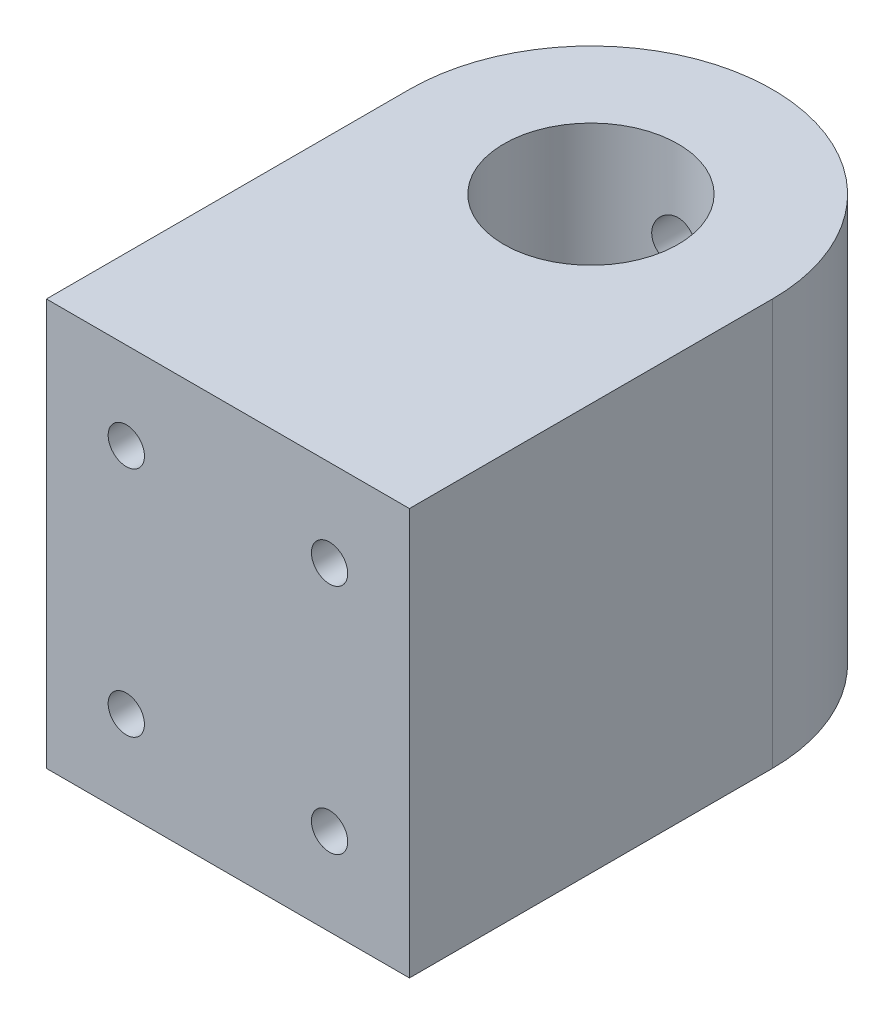
ISO-10303-21;
HEADER;
FILE_DESCRIPTION(('STEP AP214'),'2;1');
FILE_NAME('part.step','',(''),(''),'','','');
FILE_SCHEMA(('AUTOMOTIVE_DESIGN { 1 0 10303 214 1 1 1 1 }'));
ENDSEC;
DATA;
#1=APPLICATION_CONTEXT('core data for automotive mechanical design processes');
#2=APPLICATION_PROTOCOL_DEFINITION('international standard','automotive_design',2000,#1);
#3=PRODUCT_CONTEXT('',#1,'mechanical');
#4=PRODUCT('Part','Part','',(#3));
#5=PRODUCT_RELATED_PRODUCT_CATEGORY('part','',(#4));
#6=PRODUCT_DEFINITION_FORMATION('','',#4);
#7=PRODUCT_DEFINITION_CONTEXT('part definition',#1,'design');
#8=PRODUCT_DEFINITION('design','',#6,#7);
#9=PRODUCT_DEFINITION_SHAPE('','',#8);
#10=(LENGTH_UNIT() NAMED_UNIT(*) SI_UNIT(.MILLI.,.METRE.));
#11=(NAMED_UNIT(*) PLANE_ANGLE_UNIT() SI_UNIT($,.RADIAN.));
#12=(NAMED_UNIT(*) SI_UNIT($,.STERADIAN.) SOLID_ANGLE_UNIT());
#13=UNCERTAINTY_MEASURE_WITH_UNIT(LENGTH_MEASURE(1.E-05),#10,'distance_accuracy_value','');
#14=(GEOMETRIC_REPRESENTATION_CONTEXT(3) GLOBAL_UNCERTAINTY_ASSIGNED_CONTEXT((#13)) GLOBAL_UNIT_ASSIGNED_CONTEXT((#10,
#11,#12)) REPRESENTATION_CONTEXT('',''));
#15=CARTESIAN_POINT('',(0.,0.,0.));
#16=DIRECTION('',(0.,0.,1.));
#17=DIRECTION('',(1.,0.,0.));
#18=AXIS2_PLACEMENT_3D('',#15,#16,#17);
#19=CARTESIAN_POINT('',(0.,14.,0.));
#20=DIRECTION('',(0.,1.,0.));
#21=DIRECTION('',(0.,0.,1.));
#22=AXIS2_PLACEMENT_3D('',#19,#20,#21);
#23=PLANE('',#22);
#24=CARTESIAN_POINT('',(0.,14.,0.));
#25=DIRECTION('',(0.,1.,0.));
#26=DIRECTION('',(0.,0.,1.));
#27=AXIS2_PLACEMENT_3D('',#24,#25,#26);
#28=CIRCLE('',#27,12.5);
#29=CARTESIAN_POINT('',(12.5,14.,0.));
#30=VERTEX_POINT('',#29);
#31=CARTESIAN_POINT('',(-12.5,14.,0.));
#32=VERTEX_POINT('',#31);
#33=EDGE_CURVE('E178',#30,#32,#28,.T.);
#34=ORIENTED_EDGE('',*,*,#33,.T.);
#35=DIRECTION('',(0.,0.,1.));
#36=VECTOR('',#35,1.);
#37=CARTESIAN_POINT('',(-12.5,14.,25.));
#38=LINE('',#37,#36);
#39=CARTESIAN_POINT('',(-12.5,14.,25.));
#40=VERTEX_POINT('',#39);
#41=EDGE_CURVE('E95',#32,#40,#38,.T.);
#42=ORIENTED_EDGE('',*,*,#41,.T.);
#43=DIRECTION('',(1.,0.,0.));
#44=VECTOR('',#43,1.);
#45=CARTESIAN_POINT('',(-12.5,14.,25.));
#46=LINE('',#45,#44);
#47=CARTESIAN_POINT('',(12.5,14.,25.));
#48=VERTEX_POINT('',#47);
#49=EDGE_CURVE('E187',#40,#48,#46,.T.);
#50=ORIENTED_EDGE('',*,*,#49,.T.);
#51=DIRECTION('',(0.,0.,-1.));
#52=VECTOR('',#51,1.);
#53=CARTESIAN_POINT('',(12.5,14.,25.));
#54=LINE('',#53,#52);
#55=EDGE_CURVE('E64',#48,#30,#54,.T.);
#56=ORIENTED_EDGE('',*,*,#55,.T.);
#57=EDGE_LOOP('',(#34,#42,#50,#56));
#58=FACE_BOUND('',#57,.T.);
#59=CARTESIAN_POINT('',(0.,14.,0.));
#60=DIRECTION('',(0.,1.,0.));
#61=DIRECTION('',(0.,0.,1.));
#62=AXIS2_PLACEMENT_3D('',#59,#60,#61);
#63=CIRCLE('',#62,6.);
#64=CARTESIAN_POINT('',(0.,14.,6.));
#65=VERTEX_POINT('',#64);
#66=EDGE_CURVE('E185',#65,#65,#63,.T.);
#67=ORIENTED_EDGE('',*,*,#66,.F.);
#68=EDGE_LOOP('',(#67));
#69=FACE_BOUND('',#68,.T.);
#70=ADVANCED_FACE('F40',(#58,#69),#23,.T.);
#71=CARTESIAN_POINT('',(0.,-14.,0.));
#72=DIRECTION('',(0.,1.,0.));
#73=DIRECTION('',(0.,0.,1.));
#74=AXIS2_PLACEMENT_3D('',#71,#72,#73);
#75=PLANE('',#74);
#76=CARTESIAN_POINT('',(0.,-14.,0.));
#77=DIRECTION('',(0.,1.,0.));
#78=DIRECTION('',(0.,0.,1.));
#79=AXIS2_PLACEMENT_3D('',#76,#77,#78);
#80=CIRCLE('',#79,12.5);
#81=CARTESIAN_POINT('',(12.5,-14.,0.));
#82=VERTEX_POINT('',#81);
#83=CARTESIAN_POINT('',(-12.5,-14.,0.));
#84=VERTEX_POINT('',#83);
#85=EDGE_CURVE('E182',#82,#84,#80,.T.);
#86=ORIENTED_EDGE('',*,*,#85,.F.);
#87=DIRECTION('',(0.,0.,-1.));
#88=VECTOR('',#87,1.);
#89=CARTESIAN_POINT('',(12.5,-14.,25.));
#90=LINE('',#89,#88);
#91=CARTESIAN_POINT('',(12.5,-14.,25.));
#92=VERTEX_POINT('',#91);
#93=EDGE_CURVE('E88',#92,#82,#90,.T.);
#94=ORIENTED_EDGE('',*,*,#93,.F.);
#95=DIRECTION('',(1.,0.,0.));
#96=VECTOR('',#95,1.);
#97=CARTESIAN_POINT('',(-12.5,-14.,25.));
#98=LINE('',#97,#96);
#99=CARTESIAN_POINT('',(-12.5,-14.,25.));
#100=VERTEX_POINT('',#99);
#101=EDGE_CURVE('E82',#100,#92,#98,.T.);
#102=ORIENTED_EDGE('',*,*,#101,.F.);
#103=DIRECTION('',(0.,0.,1.));
#104=VECTOR('',#103,1.);
#105=CARTESIAN_POINT('',(-12.5,-14.,25.));
#106=LINE('',#105,#104);
#107=EDGE_CURVE('E180',#84,#100,#106,.T.);
#108=ORIENTED_EDGE('',*,*,#107,.F.);
#109=EDGE_LOOP('',(#86,#94,#102,#108));
#110=FACE_BOUND('',#109,.T.);
#111=CARTESIAN_POINT('',(0.,-14.,0.));
#112=DIRECTION('',(0.,1.,0.));
#113=DIRECTION('',(0.,0.,1.));
#114=AXIS2_PLACEMENT_3D('',#111,#112,#113);
#115=CIRCLE('',#114,6.);
#116=CARTESIAN_POINT('',(0.,-14.,6.));
#117=VERTEX_POINT('',#116);
#118=EDGE_CURVE('E191',#117,#117,#115,.T.);
#119=ORIENTED_EDGE('',*,*,#118,.T.);
#120=EDGE_LOOP('',(#119));
#121=FACE_BOUND('',#120,.T.);
#122=ADVANCED_FACE('F199',(#110,#121),#75,.F.);
#123=CARTESIAN_POINT('',(0.,14.,0.));
#124=DIRECTION('',(0.,-1.,0.));
#125=DIRECTION('',(0.,0.,-1.));
#126=AXIS2_PLACEMENT_3D('',#123,#124,#125);
#127=CYLINDRICAL_SURFACE('',#126,12.5);
#128=CARTESIAN_POINT('',(0.,9.6,-12.5));
#129=CARTESIAN_POINT('',(-0.0894802285816259,9.59999620967843,-12.4999987273405));
#130=CARTESIAN_POINT('',(-0.179015931675331,9.59246839578162,-12.499029056014));
#131=CARTESIAN_POINT('',(-0.355594628622663,9.56255800254797,-12.4952541222134));
#132=CARTESIAN_POINT('',(-0.44263494147155,9.540160028126,-12.4924469574237));
#133=CARTESIAN_POINT('',(-0.611641054255219,9.48118108672698,-12.4853131928751));
#134=CARTESIAN_POINT('',(-0.693610272484019,9.44460979712003,-12.4809876300497));
#135=CARTESIAN_POINT('',(-0.850232699633243,9.35834380168914,-12.4712978138664));
#136=CARTESIAN_POINT('',(-0.92488713401849,9.30865129926813,-12.4659337349434));
#137=CARTESIAN_POINT('',(-1.0652061611174,9.19724751808118,-12.4547309610872));
#138=CARTESIAN_POINT('',(-1.1308225327694,9.13547572738356,-12.4488899665847));
#139=CARTESIAN_POINT('',(-1.25078744700971,9.00179681121915,-12.437410158438));
#140=CARTESIAN_POINT('',(-1.30513540756856,8.92988916254297,-12.4317713552498));
#141=CARTESIAN_POINT('',(-1.40120131878558,8.77766511768412,-12.4213117857827));
#142=CARTESIAN_POINT('',(-1.44287391980583,8.69731988094322,-12.4164939832712));
#143=CARTESIAN_POINT('',(-1.51211654458473,8.53069940043074,-12.4082523672039));
#144=CARTESIAN_POINT('',(-1.53968712861921,8.44442439240461,-12.4048284982681));
#145=CARTESIAN_POINT('',(-1.57979618302578,8.2688946901791,-12.3997844564613));
#146=CARTESIAN_POINT('',(-1.59241621355555,8.17965891876555,-12.3981545007017));
#147=CARTESIAN_POINT('',(-1.60251833190295,8.00032233106304,-12.3968529255545));
#148=CARTESIAN_POINT('',(-1.6000010570764,7.9102215513547,-12.3971812237147));
#149=CARTESIAN_POINT('',(-1.57996693859598,7.73228183611032,-12.3997501103633));
#150=CARTESIAN_POINT('',(-1.56254004625942,7.64443258388437,-12.4019792307219));
#151=CARTESIAN_POINT('',(-1.51332177543579,7.47291569892478,-12.4080807060494));
#152=CARTESIAN_POINT('',(-1.48153009300948,7.38924815471194,-12.4119530957876));
#153=CARTESIAN_POINT('',(-1.40438835528284,7.22819089610096,-12.420917754726));
#154=CARTESIAN_POINT('',(-1.35899932073846,7.15082005430809,-12.4260135225035));
#155=CARTESIAN_POINT('',(-1.2559791774554,7.00475931740199,-12.436848087927));
#156=CARTESIAN_POINT('',(-1.19834748171951,6.93606983878486,-12.4425869163993));
#157=CARTESIAN_POINT('',(-1.07197998078475,6.80879964922306,-12.4541119267274));
#158=CARTESIAN_POINT('',(-1.00316666356942,6.75029587679708,-12.4598981501205));
#159=CARTESIAN_POINT('',(-0.856655860376901,6.64565723817514,-12.4708270736414));
#160=CARTESIAN_POINT('',(-0.778958352182545,6.5995224029118,-12.47596977216));
#161=CARTESIAN_POINT('',(-0.616824567175368,6.52093075032636,-12.4850356169908));
#162=CARTESIAN_POINT('',(-0.532385869092663,6.48847887411384,-12.4889583226125));
#163=CARTESIAN_POINT('',(-0.35919633701333,6.43823604801821,-12.4951382424324));
#164=CARTESIAN_POINT('',(-0.270445714989223,6.42044437821569,-12.4973955384135));
#165=CARTESIAN_POINT('',(-0.0918167515699816,6.40012700959609,-12.4999796501206));
#166=CARTESIAN_POINT('',(-0.00195064871834218,6.39749534784532,-12.5003198651777));
#167=CARTESIAN_POINT('',(0.17694133611066,6.40729288149859,-12.4990676925075));
#168=CARTESIAN_POINT('',(0.265967236826347,6.41972174021674,-12.4974753479835));
#169=CARTESIAN_POINT('',(0.440338117066494,6.45919946579896,-12.4925453163349));
#170=CARTESIAN_POINT('',(0.525694748548654,6.48619768618058,-12.4892136767036));
#171=CARTESIAN_POINT('',(0.690668995940678,6.55399501584473,-12.4811779750741));
#172=CARTESIAN_POINT('',(0.770286408285864,6.59479461435722,-12.4764738644255));
#173=CARTESIAN_POINT('',(0.921994603640622,6.68929205705903,-12.4661840779527));
#174=CARTESIAN_POINT('',(0.994042464202555,6.74305829818892,-12.4605937831078));
#175=CARTESIAN_POINT('',(1.12812939052348,6.8618662084161,-12.449171101846));
#176=CARTESIAN_POINT('',(1.19016803872729,6.92690834767634,-12.4433387053422));
#177=CARTESIAN_POINT('',(1.30285251542755,7.0668890712877,-12.4320476984862));
#178=CARTESIAN_POINT('',(1.35342801356351,7.1418844975014,-12.4265915313144));
#179=CARTESIAN_POINT('',(1.4412643372584,7.29936771524115,-12.4167112819757));
#180=CARTESIAN_POINT('',(1.47852544058671,7.38185535041719,-12.412287178278));
#181=CARTESIAN_POINT('',(1.53856194060305,7.55175644772714,-12.4049887339945));
#182=CARTESIAN_POINT('',(1.56137669650311,7.63915581334673,-12.402110185814));
#183=CARTESIAN_POINT('',(1.59199947328775,7.81658438483018,-12.3982168029281));
#184=CARTESIAN_POINT('',(1.5998082290268,7.90661346169601,-12.3972018769598));
#185=CARTESIAN_POINT('',(1.60018341763843,8.08604603654271,-12.3971533974092));
#186=CARTESIAN_POINT('',(1.59286034966409,8.17544931965463,-12.3981054798688));
#187=CARTESIAN_POINT('',(1.56341406955244,8.3517430461862,-12.4018528226023));
#188=CARTESIAN_POINT('',(1.5412908582596,8.43863348974923,-12.4046480827711));
#189=CARTESIAN_POINT('',(1.48290735295564,8.60741869827694,-12.4117623181005));
#190=CARTESIAN_POINT('',(1.44665265140134,8.68931542466838,-12.4160806904338));
#191=CARTESIAN_POINT('',(1.36104616807924,8.84588076445767,-12.4257555410229));
#192=CARTESIAN_POINT('',(1.31169419076938,8.92054926991562,-12.4311120347776));
#193=CARTESIAN_POINT('',(1.20088500594448,9.0611031143029,-12.4423064236852));
#194=CARTESIAN_POINT('',(1.13934548813475,9.12692331925843,-12.4481474258925));
#195=CARTESIAN_POINT('',(1.00608024349137,9.24734465846945,-12.4596254256836));
#196=CARTESIAN_POINT('',(0.934352122786102,9.30194314871966,-12.4652623749325));
#197=CARTESIAN_POINT('',(0.782416832255792,9.39855763892584,-12.4757220565273));
#198=CARTESIAN_POINT('',(0.70217702349394,9.44052264875535,-12.4805414558997));
#199=CARTESIAN_POINT('',(0.53577133773657,9.51032195627665,-12.4887894105534));
#200=CARTESIAN_POINT('',(0.44961198188554,9.53817152925444,-12.4922194685257));
#201=CARTESIAN_POINT('',(0.302510950691842,9.57232134620841,-12.4964802335958));
#202=CARTESIAN_POINT('',(0.242494895059007,9.58268582111948,-12.4977936774923));
#203=CARTESIAN_POINT('',(0.121661104986523,9.59652640954901,-12.4995539899657));
#204=CARTESIAN_POINT('',(0.06084337686048,9.60000257728402,-12.5000008653632));
#205=CARTESIAN_POINT('',(0.,9.6,-12.5));
#206=B_SPLINE_CURVE_WITH_KNOTS('',3,(#128,#129,#130,#131,#132,#133,#134,#135,#136,#137,#138,
#139,#140,#141,#142,#143,#144,#145,#146,#147,#148,#149,#150,#151,#152,#153,#154,#155,#156,#157,
#158,#159,#160,#161,#162,#163,#164,#165,#166,#167,#168,#169,#170,#171,#172,#173,#174,#175,#176,
#177,#178,#179,#180,#181,#182,#183,#184,#185,#186,#187,#188,#189,#190,#191,#192,#193,#194,#195,
#196,#197,#198,#199,#200,#201,#202,#203,#204,#205),.UNSPECIFIED.,.T.,.F.,(4,2,2,2,2,2,2,2,2,2,2,
2,2,2,2,2,2,2,2,2,2,2,2,2,2,2,2,2,2,2,2,2,2,2,2,2,2,2,4),(0.,0.268218434758675,
0.536714990137084,0.805028541347211,1.07329706415196,1.34294561260607,1.61260808532342,
1.88322429991685,2.1538297620413,2.42295208338281,2.692063073416,2.95956184546622,
3.22706627768814,3.49534501926247,3.76363662686556,4.0338743020149,4.30411265297677,
4.57444850741439,4.84477108566594,5.11320189318709,5.38162669990669,5.64912435462915,
5.91663149257689,6.18558179759111,6.45454331952938,6.7251128495115,6.99567673445154,
7.26550025725746,7.53531056627734,7.80315756768865,8.07100455381704,8.33874564846965,
8.6064907407163,8.87610985931487,9.14579243160439,9.41654931327234,9.68701256131166,
9.86939300460507,10.0517720124108),.UNSPECIFIED.);
#207=CARTESIAN_POINT('',(0.,9.6,-12.5));
#208=VERTEX_POINT('',#207);
#209=EDGE_CURVE('E141',#208,#208,#206,.T.);
#210=ORIENTED_EDGE('',*,*,#209,.T.);
#211=EDGE_LOOP('',(#210));
#212=FACE_BOUND('',#211,.T.);
#213=CARTESIAN_POINT('',(0.,-9.6,-12.5));
#214=CARTESIAN_POINT('',(0.0894802285816259,-9.59999620967843,-12.4999987273405));
#215=CARTESIAN_POINT('',(0.179015931675331,-9.59246839578162,-12.499029056014));
#216=CARTESIAN_POINT('',(0.355594628622663,-9.56255800254797,-12.4952541222134));
#217=CARTESIAN_POINT('',(0.44263494147155,-9.540160028126,-12.4924469574237));
#218=CARTESIAN_POINT('',(0.611641054255219,-9.48118108672698,-12.4853131928751));
#219=CARTESIAN_POINT('',(0.693610272484019,-9.44460979712003,-12.4809876300497));
#220=CARTESIAN_POINT('',(0.850232699633243,-9.35834380168914,-12.4712978138664));
#221=CARTESIAN_POINT('',(0.92488713401849,-9.30865129926813,-12.4659337349434));
#222=CARTESIAN_POINT('',(1.0652061611174,-9.19724751808118,-12.4547309610872));
#223=CARTESIAN_POINT('',(1.1308225327694,-9.13547572738356,-12.4488899665847));
#224=CARTESIAN_POINT('',(1.25078744700971,-9.00179681121915,-12.437410158438));
#225=CARTESIAN_POINT('',(1.30513540756856,-8.92988916254297,-12.4317713552498));
#226=CARTESIAN_POINT('',(1.40120131878558,-8.77766511768412,-12.4213117857827));
#227=CARTESIAN_POINT('',(1.44287391980583,-8.69731988094322,-12.4164939832712));
#228=CARTESIAN_POINT('',(1.51211654458473,-8.53069940043074,-12.4082523672039));
#229=CARTESIAN_POINT('',(1.53968712861921,-8.44442439240461,-12.4048284982681));
#230=CARTESIAN_POINT('',(1.57979618302578,-8.2688946901791,-12.3997844564613));
#231=CARTESIAN_POINT('',(1.59241621355555,-8.17965891876555,-12.3981545007017));
#232=CARTESIAN_POINT('',(1.60251833190295,-8.00032233106304,-12.3968529255545));
#233=CARTESIAN_POINT('',(1.6000010570764,-7.9102215513547,-12.3971812237147));
#234=CARTESIAN_POINT('',(1.57996693859598,-7.73228183611032,-12.3997501103633));
#235=CARTESIAN_POINT('',(1.56254004625942,-7.64443258388437,-12.4019792307219));
#236=CARTESIAN_POINT('',(1.51332177543579,-7.47291569892478,-12.4080807060494));
#237=CARTESIAN_POINT('',(1.48153009300948,-7.38924815471194,-12.4119530957876));
#238=CARTESIAN_POINT('',(1.40438835528284,-7.22819089610096,-12.420917754726));
#239=CARTESIAN_POINT('',(1.35899932073846,-7.15082005430809,-12.4260135225035));
#240=CARTESIAN_POINT('',(1.2559791774554,-7.00475931740199,-12.436848087927));
#241=CARTESIAN_POINT('',(1.19834748171951,-6.93606983878486,-12.4425869163993));
#242=CARTESIAN_POINT('',(1.07197998078475,-6.80879964922306,-12.4541119267274));
#243=CARTESIAN_POINT('',(1.00316666356942,-6.75029587679708,-12.4598981501205));
#244=CARTESIAN_POINT('',(0.856655860376901,-6.64565723817514,-12.4708270736414));
#245=CARTESIAN_POINT('',(0.778958352182545,-6.5995224029118,-12.47596977216));
#246=CARTESIAN_POINT('',(0.616824567175368,-6.52093075032636,-12.4850356169908));
#247=CARTESIAN_POINT('',(0.532385869092663,-6.48847887411384,-12.4889583226125));
#248=CARTESIAN_POINT('',(0.35919633701333,-6.43823604801821,-12.4951382424324));
#249=CARTESIAN_POINT('',(0.270445714989223,-6.42044437821569,-12.4973955384135));
#250=CARTESIAN_POINT('',(0.0918167515699816,-6.40012700959609,-12.4999796501206));
#251=CARTESIAN_POINT('',(0.00195064871834218,-6.39749534784532,-12.5003198651777));
#252=CARTESIAN_POINT('',(-0.17694133611066,-6.40729288149859,-12.4990676925075));
#253=CARTESIAN_POINT('',(-0.265967236826347,-6.41972174021674,-12.4974753479835));
#254=CARTESIAN_POINT('',(-0.440338117066494,-6.45919946579896,-12.4925453163349));
#255=CARTESIAN_POINT('',(-0.525694748548654,-6.48619768618058,-12.4892136767036));
#256=CARTESIAN_POINT('',(-0.690668995940678,-6.55399501584473,-12.4811779750741));
#257=CARTESIAN_POINT('',(-0.770286408285864,-6.59479461435722,-12.4764738644255));
#258=CARTESIAN_POINT('',(-0.921994603640622,-6.68929205705903,-12.4661840779527));
#259=CARTESIAN_POINT('',(-0.994042464202555,-6.74305829818892,-12.4605937831078));
#260=CARTESIAN_POINT('',(-1.12812939052348,-6.8618662084161,-12.449171101846));
#261=CARTESIAN_POINT('',(-1.19016803872729,-6.92690834767634,-12.4433387053422));
#262=CARTESIAN_POINT('',(-1.30285251542755,-7.0668890712877,-12.4320476984862));
#263=CARTESIAN_POINT('',(-1.35342801356351,-7.1418844975014,-12.4265915313144));
#264=CARTESIAN_POINT('',(-1.4412643372584,-7.29936771524115,-12.4167112819757));
#265=CARTESIAN_POINT('',(-1.47852544058671,-7.38185535041719,-12.412287178278));
#266=CARTESIAN_POINT('',(-1.53856194060305,-7.55175644772714,-12.4049887339945));
#267=CARTESIAN_POINT('',(-1.56137669650311,-7.63915581334673,-12.402110185814));
#268=CARTESIAN_POINT('',(-1.59199947328775,-7.81658438483018,-12.3982168029281));
#269=CARTESIAN_POINT('',(-1.5998082290268,-7.90661346169601,-12.3972018769598));
#270=CARTESIAN_POINT('',(-1.60018341763843,-8.08604603654271,-12.3971533974092));
#271=CARTESIAN_POINT('',(-1.59286034966409,-8.17544931965463,-12.3981054798688));
#272=CARTESIAN_POINT('',(-1.56341406955244,-8.3517430461862,-12.4018528226023));
#273=CARTESIAN_POINT('',(-1.5412908582596,-8.43863348974923,-12.4046480827711));
#274=CARTESIAN_POINT('',(-1.48290735295564,-8.60741869827694,-12.4117623181005));
#275=CARTESIAN_POINT('',(-1.44665265140134,-8.68931542466838,-12.4160806904338));
#276=CARTESIAN_POINT('',(-1.36104616807924,-8.84588076445767,-12.4257555410229));
#277=CARTESIAN_POINT('',(-1.31169419076938,-8.92054926991562,-12.4311120347776));
#278=CARTESIAN_POINT('',(-1.20088500594448,-9.0611031143029,-12.4423064236852));
#279=CARTESIAN_POINT('',(-1.13934548813475,-9.12692331925843,-12.4481474258925));
#280=CARTESIAN_POINT('',(-1.00608024349137,-9.24734465846945,-12.4596254256836));
#281=CARTESIAN_POINT('',(-0.934352122786102,-9.30194314871966,-12.4652623749325));
#282=CARTESIAN_POINT('',(-0.782416832255792,-9.39855763892584,-12.4757220565273));
#283=CARTESIAN_POINT('',(-0.70217702349394,-9.44052264875535,-12.4805414558997));
#284=CARTESIAN_POINT('',(-0.53577133773657,-9.51032195627665,-12.4887894105534));
#285=CARTESIAN_POINT('',(-0.44961198188554,-9.53817152925444,-12.4922194685257));
#286=CARTESIAN_POINT('',(-0.302510950691842,-9.57232134620841,-12.4964802335958));
#287=CARTESIAN_POINT('',(-0.242494895059007,-9.58268582111948,-12.4977936774923));
#288=CARTESIAN_POINT('',(-0.121661104986523,-9.59652640954901,-12.4995539899657));
#289=CARTESIAN_POINT('',(-0.06084337686048,-9.60000257728402,-12.5000008653632));
#290=CARTESIAN_POINT('',(0.,-9.6,-12.5));
#291=B_SPLINE_CURVE_WITH_KNOTS('',3,(#213,#214,#215,#216,#217,#218,#219,#220,#221,#222,#223,
#224,#225,#226,#227,#228,#229,#230,#231,#232,#233,#234,#235,#236,#237,#238,#239,#240,#241,#242,
#243,#244,#245,#246,#247,#248,#249,#250,#251,#252,#253,#254,#255,#256,#257,#258,#259,#260,#261,
#262,#263,#264,#265,#266,#267,#268,#269,#270,#271,#272,#273,#274,#275,#276,#277,#278,#279,#280,
#281,#282,#283,#284,#285,#286,#287,#288,#289,#290),.UNSPECIFIED.,.T.,.F.,(4,2,2,2,2,2,2,2,2,2,2,
2,2,2,2,2,2,2,2,2,2,2,2,2,2,2,2,2,2,2,2,2,2,2,2,2,2,2,4),(0.,0.268218434758675,
0.536714990137084,0.805028541347211,1.07329706415196,1.34294561260607,1.61260808532342,
1.88322429991685,2.1538297620413,2.42295208338281,2.692063073416,2.95956184546622,
3.22706627768814,3.49534501926247,3.76363662686556,4.0338743020149,4.30411265297677,
4.57444850741439,4.84477108566594,5.11320189318709,5.38162669990669,5.64912435462915,
5.91663149257689,6.18558179759111,6.45454331952938,6.7251128495115,6.99567673445154,
7.26550025725746,7.53531056627734,7.80315756768865,8.07100455381704,8.33874564846965,
8.6064907407163,8.87610985931487,9.14579243160439,9.41654931327234,9.68701256131166,
9.86939300460507,10.0517720124108),.UNSPECIFIED.);
#292=CARTESIAN_POINT('',(0.,-9.6,-12.5));
#293=VERTEX_POINT('',#292);
#294=EDGE_CURVE('E147',#293,#293,#291,.T.);
#295=ORIENTED_EDGE('',*,*,#294,.T.);
#296=EDGE_LOOP('',(#295));
#297=FACE_BOUND('',#296,.T.);
#298=ORIENTED_EDGE('',*,*,#85,.T.);
#299=DIRECTION('',(0.,-1.,0.));
#300=VECTOR('',#299,1.);
#301=CARTESIAN_POINT('',(-12.5,14.,0.));
#302=LINE('',#301,#300);
#303=EDGE_CURVE('E11',#32,#84,#302,.T.);
#304=ORIENTED_EDGE('',*,*,#303,.F.);
#305=ORIENTED_EDGE('',*,*,#33,.F.);
#306=DIRECTION('',(0.,-1.,0.));
#307=VECTOR('',#306,1.);
#308=CARTESIAN_POINT('',(12.5,14.,0.));
#309=LINE('',#308,#307);
#310=EDGE_CURVE('E175',#30,#82,#309,.T.);
#311=ORIENTED_EDGE('',*,*,#310,.T.);
#312=EDGE_LOOP('',(#298,#304,#305,#311));
#313=FACE_BOUND('',#312,.T.);
#314=ADVANCED_FACE('F42',(#212,#297,#313),#127,.T.);
#315=CARTESIAN_POINT('',(-12.5,14.,25.));
#316=DIRECTION('',(1.,0.,0.));
#317=DIRECTION('',(0.,0.,-1.));
#318=AXIS2_PLACEMENT_3D('',#315,#316,#317);
#319=PLANE('',#318);
#320=ORIENTED_EDGE('',*,*,#107,.T.);
#321=DIRECTION('',(0.,-1.,0.));
#322=VECTOR('',#321,1.);
#323=CARTESIAN_POINT('',(-12.5,14.,25.));
#324=LINE('',#323,#322);
#325=EDGE_CURVE('E55',#40,#100,#324,.T.);
#326=ORIENTED_EDGE('',*,*,#325,.F.);
#327=ORIENTED_EDGE('',*,*,#41,.F.);
#328=ORIENTED_EDGE('',*,*,#303,.T.);
#329=EDGE_LOOP('',(#320,#326,#327,#328));
#330=FACE_BOUND('',#329,.T.);
#331=ADVANCED_FACE('F211',(#330),#319,.F.);
#332=CARTESIAN_POINT('',(-12.5,14.,25.));
#333=DIRECTION('',(0.,0.,-1.));
#334=DIRECTION('',(-1.,0.,0.));
#335=AXIS2_PLACEMENT_3D('',#332,#333,#334);
#336=PLANE('',#335);
#337=CARTESIAN_POINT('',(-7.,-8.,25.));
#338=DIRECTION('',(0.,0.,1.));
#339=DIRECTION('',(1.,0.,0.));
#340=AXIS2_PLACEMENT_3D('',#337,#338,#339);
#341=CIRCLE('',#340,1.24999999999999);
#342=CARTESIAN_POINT('',(-5.75000000000001,-8.,25.));
#343=VERTEX_POINT('',#342);
#344=EDGE_CURVE('E119',#343,#343,#341,.T.);
#345=ORIENTED_EDGE('',*,*,#344,.F.);
#346=EDGE_LOOP('',(#345));
#347=FACE_BOUND('',#346,.T.);
#348=CARTESIAN_POINT('',(7.,-8.,25.));
#349=DIRECTION('',(0.,0.,1.));
#350=DIRECTION('',(1.,0.,0.));
#351=AXIS2_PLACEMENT_3D('',#348,#349,#350);
#352=CIRCLE('',#351,1.24999999999999);
#353=CARTESIAN_POINT('',(8.24999999999999,-8.,25.));
#354=VERTEX_POINT('',#353);
#355=EDGE_CURVE('E118',#354,#354,#352,.T.);
#356=ORIENTED_EDGE('',*,*,#355,.F.);
#357=EDGE_LOOP('',(#356));
#358=FACE_BOUND('',#357,.T.);
#359=CARTESIAN_POINT('',(7.,8.,25.));
#360=DIRECTION('',(0.,0.,1.));
#361=DIRECTION('',(1.,0.,0.));
#362=AXIS2_PLACEMENT_3D('',#359,#360,#361);
#363=CIRCLE('',#362,1.24999999999999);
#364=CARTESIAN_POINT('',(8.24999999999999,8.,25.));
#365=VERTEX_POINT('',#364);
#366=EDGE_CURVE('E129',#365,#365,#363,.T.);
#367=ORIENTED_EDGE('',*,*,#366,.F.);
#368=EDGE_LOOP('',(#367));
#369=FACE_BOUND('',#368,.T.);
#370=CARTESIAN_POINT('',(-7.,8.,25.));
#371=DIRECTION('',(0.,0.,1.));
#372=DIRECTION('',(1.,0.,0.));
#373=AXIS2_PLACEMENT_3D('',#370,#371,#372);
#374=CIRCLE('',#373,1.24999999999999);
#375=CARTESIAN_POINT('',(-5.75000000000001,8.,25.));
#376=VERTEX_POINT('',#375);
#377=EDGE_CURVE('E135',#376,#376,#374,.T.);
#378=ORIENTED_EDGE('',*,*,#377,.F.);
#379=EDGE_LOOP('',(#378));
#380=FACE_BOUND('',#379,.T.);
#381=ORIENTED_EDGE('',*,*,#101,.T.);
#382=DIRECTION('',(0.,-1.,0.));
#383=VECTOR('',#382,1.);
#384=CARTESIAN_POINT('',(12.5,14.,25.));
#385=LINE('',#384,#383);
#386=EDGE_CURVE('E173',#48,#92,#385,.T.);
#387=ORIENTED_EDGE('',*,*,#386,.F.);
#388=ORIENTED_EDGE('',*,*,#49,.F.);
#389=ORIENTED_EDGE('',*,*,#325,.T.);
#390=EDGE_LOOP('',(#381,#387,#388,#389));
#391=FACE_BOUND('',#390,.T.);
#392=ADVANCED_FACE('F209',(#347,#358,#369,#380,#391),#336,.F.);
#393=CARTESIAN_POINT('',(12.5,14.,25.));
#394=DIRECTION('',(-1.,0.,0.));
#395=DIRECTION('',(0.,0.,1.));
#396=AXIS2_PLACEMENT_3D('',#393,#394,#395);
#397=PLANE('',#396);
#398=ORIENTED_EDGE('',*,*,#93,.T.);
#399=ORIENTED_EDGE('',*,*,#310,.F.);
#400=ORIENTED_EDGE('',*,*,#55,.F.);
#401=ORIENTED_EDGE('',*,*,#386,.T.);
#402=EDGE_LOOP('',(#398,#399,#400,#401));
#403=FACE_BOUND('',#402,.T.);
#404=ADVANCED_FACE('F206',(#403),#397,.F.);
#405=CARTESIAN_POINT('',(0.,14.,0.));
#406=DIRECTION('',(0.,-1.,0.));
#407=DIRECTION('',(0.,0.,-1.));
#408=AXIS2_PLACEMENT_3D('',#405,#406,#407);
#409=CYLINDRICAL_SURFACE('',#408,6.);
#410=CARTESIAN_POINT('',(0.,9.6,-6.));
#411=CARTESIAN_POINT('',(-0.0882036446662834,9.59999790645212,-5.9999986704813));
#412=CARTESIAN_POINT('',(-0.176429728177472,9.59268190864826,-5.99803588929723));
#413=CARTESIAN_POINT('',(-0.350340361083571,9.56366301540905,-5.99039658897325));
#414=CARTESIAN_POINT('',(-0.436023666655269,9.54195319645911,-5.98471828266059));
#415=CARTESIAN_POINT('',(-0.60231327123625,9.48490266650877,-5.97027466602242));
#416=CARTESIAN_POINT('',(-0.682925960812229,9.44957952986717,-5.96151333704337));
#417=CARTESIAN_POINT('',(-0.837082949114125,9.36637020586672,-5.94182959321305));
#418=CARTESIAN_POINT('',(-0.910626776359695,9.31848318131262,-5.93090703436005));
#419=CARTESIAN_POINT('',(-1.05026360299202,9.21033318686926,-5.90779691921738));
#420=CARTESIAN_POINT('',(-1.11616935189025,9.14983306559322,-5.8955877414348));
#421=CARTESIAN_POINT('',(-1.23702970928508,9.01868121354949,-5.87141927743138));
#422=CARTESIAN_POINT('',(-1.29198290796523,8.94802817790661,-5.85946002355797));
#423=CARTESIAN_POINT('',(-1.39029127394741,8.797081412139,-5.83692429973529));
#424=CARTESIAN_POINT('',(-1.43343102189222,8.71664293738821,-5.82637510858234));
#425=CARTESIAN_POINT('',(-1.50550038461563,8.54932791112846,-5.80817181846909));
#426=CARTESIAN_POINT('',(-1.53443261960976,8.46245255014382,-5.8005171857408));
#427=CARTESIAN_POINT('',(-1.5766153618114,8.28680356973868,-5.78919292669855));
#428=CARTESIAN_POINT('',(-1.59020536195949,8.19811716803827,-5.78543718352245));
#429=CARTESIAN_POINT('',(-1.60237627764874,8.01964985333367,-5.78207864835752));
#430=CARTESIAN_POINT('',(-1.60095999764589,7.92986914797151,-5.78247508038722));
#431=CARTESIAN_POINT('',(-1.58342808002097,7.7544116677021,-5.78729903015237));
#432=CARTESIAN_POINT('',(-1.56772324851795,7.66869025436957,-5.79161388402152));
#433=CARTESIAN_POINT('',(-1.52271798977763,7.50114533243464,-5.80360810471625));
#434=CARTESIAN_POINT('',(-1.493416475944,7.41932213593963,-5.81128774043995));
#435=CARTESIAN_POINT('',(-1.421714855722,7.26082548495324,-5.82924529396782));
#436=CARTESIAN_POINT('',(-1.37917072910226,7.18422052857102,-5.83955154254446));
#437=CARTESIAN_POINT('',(-1.28229203059023,7.03909267291875,-5.86158583714473));
#438=CARTESIAN_POINT('',(-1.22795513779401,6.97057136867482,-5.8733141628429));
#439=CARTESIAN_POINT('',(-1.10693285810735,6.84120880203617,-5.89734008503746));
#440=CARTESIAN_POINT('',(-1.03990250182639,6.78069094534804,-5.90964377191026));
#441=CARTESIAN_POINT('',(-0.896494134565098,6.67168897571977,-5.93309105021092));
#442=CARTESIAN_POINT('',(-0.820115755364072,6.62320533703806,-5.94423459590854));
#443=CARTESIAN_POINT('',(-0.659678604397961,6.53950567774028,-5.96417456318624));
#444=CARTESIAN_POINT('',(-0.57558792204143,6.50434818364113,-5.97296058266845));
#445=CARTESIAN_POINT('',(-0.402401835512316,6.4487622489493,-5.98712035520802));
#446=CARTESIAN_POINT('',(-0.313307529542658,6.42833058982083,-5.99249485386999));
#447=CARTESIAN_POINT('',(-0.135403266516411,6.40328409846574,-5.99911326846707));
#448=CARTESIAN_POINT('',(-0.0466593901131033,6.39822956811931,-6.00047197976769));
#449=CARTESIAN_POINT('',(0.130408036720959,6.40286653139755,-5.99923577353354));
#450=CARTESIAN_POINT('',(0.218731629649689,6.41255650088461,-5.99664126464274));
#451=CARTESIAN_POINT('',(0.390881959921426,6.44604675796799,-5.98786428396825));
#452=CARTESIAN_POINT('',(0.474759881622233,6.46960179695823,-5.98174421237093));
#453=CARTESIAN_POINT('',(0.637365576940846,6.52986875560634,-5.96661035915282));
#454=CARTESIAN_POINT('',(0.716092791372798,6.56658210100036,-5.9575962639682));
#455=CARTESIAN_POINT('',(0.867870779734386,6.6529391097445,-5.93740528447735));
#456=CARTESIAN_POINT('',(0.940780150769041,6.70282197343847,-5.92618949284386));
#457=CARTESIAN_POINT('',(1.07734770831762,6.81380130412612,-5.9028916189203));
#458=CARTESIAN_POINT('',(1.14100406303899,6.87489998607982,-5.89080936580444));
#459=CARTESIAN_POINT('',(1.25911139583055,7.0086284619967,-5.86671796694981));
#460=CARTESIAN_POINT('',(1.31325215399989,7.08153484912011,-5.85472049149563));
#461=CARTESIAN_POINT('',(1.40853752947959,7.23565175687572,-5.83253157740069));
#462=CARTESIAN_POINT('',(1.44968268897222,7.31686193088299,-5.82234006342218));
#463=CARTESIAN_POINT('',(1.51749929269189,7.48487624567057,-5.80503414721321));
#464=CARTESIAN_POINT('',(1.54425449804718,7.5716446494985,-5.79790198738987));
#465=CARTESIAN_POINT('',(1.58272964096634,7.74867145578706,-5.78751860185751));
#466=CARTESIAN_POINT('',(1.5944534208239,7.83892896029366,-5.78426638438256));
#467=CARTESIAN_POINT('',(1.60231191722602,8.01719583029804,-5.78209395637349));
#468=CARTESIAN_POINT('',(1.59894524494388,8.10518185620422,-5.78303518188826));
#469=CARTESIAN_POINT('',(1.5778750080045,8.27928281121043,-5.78881916870635));
#470=CARTESIAN_POINT('',(1.56017181228047,8.3653977884011,-5.79366182961091));
#471=CARTESIAN_POINT('',(1.51122012559733,8.53268460170324,-5.80662056856999));
#472=CARTESIAN_POINT('',(1.48007728860457,8.61388947418558,-5.81471108015306));
#473=CARTESIAN_POINT('',(1.40521243649916,8.76998306442748,-5.83325454509352));
#474=CARTESIAN_POINT('',(1.36148844819695,8.84487078904044,-5.84370786897202));
#475=CARTESIAN_POINT('',(1.26119127415052,8.98858428759724,-5.86618337152254));
#476=CARTESIAN_POINT('',(1.20427783814327,9.05716682798096,-5.87824266481322));
#477=CARTESIAN_POINT('',(1.07986442808881,9.18396996133387,-5.90236403026437));
#478=CARTESIAN_POINT('',(1.012361883487,9.24218803093508,-5.91442610238761));
#479=CARTESIAN_POINT('',(0.866943984870946,9.34783379011748,-5.93750249923166));
#480=CARTESIAN_POINT('',(0.788836769401423,9.39500400851946,-5.94848889051638));
#481=CARTESIAN_POINT('',(0.625510912333512,9.47546993274349,-5.9678704808232));
#482=CARTESIAN_POINT('',(0.540296875757037,9.50877454053088,-5.97626734146876));
#483=CARTESIAN_POINT('',(0.379499763904792,9.55622022833241,-5.98843802010774));
#484=CARTESIAN_POINT('',(0.304609613252029,9.572599506874,-5.99274216474082));
#485=CARTESIAN_POINT('',(0.153151836253661,9.59448976493365,-5.99852359229165));
#486=CARTESIAN_POINT('',(0.0765843763238884,9.60000181776002,-6.00000115437816));
#487=CARTESIAN_POINT('',(0.,9.6,-6.));
#488=B_SPLINE_CURVE_WITH_KNOTS('',3,(#410,#411,#412,#413,#414,#415,#416,#417,#418,#419,#420,
#421,#422,#423,#424,#425,#426,#427,#428,#429,#430,#431,#432,#433,#434,#435,#436,#437,#438,#439,
#440,#441,#442,#443,#444,#445,#446,#447,#448,#449,#450,#451,#452,#453,#454,#455,#456,#457,#458,
#459,#460,#461,#462,#463,#464,#465,#466,#467,#468,#469,#470,#471,#472,#473,#474,#475,#476,#477,
#478,#479,#480,#481,#482,#483,#484,#485,#486,#487),.UNSPECIFIED.,.T.,.F.,(4,2,2,2,2,2,2,2,2,2,2,
2,2,2,2,2,2,2,2,2,2,2,2,2,2,2,2,2,2,2,2,2,2,2,2,2,2,2,4),(0.,0.264330079159655,0.52878739500916,
0.792904442377546,1.0570390936694,1.32667918363973,1.59635395940119,1.87066066018584,
2.1449167530376,2.41297726598071,2.68098768318787,2.94152801632129,3.20208917445683,
3.4655893867253,3.72914150489436,4.00129007845189,4.2734493754541,4.54679047677765,
4.82007181747443,5.08546174014969,5.35082423135612,5.61162828509024,5.87246060615823,
6.13840228798972,6.40439654602441,6.67789197101563,6.95137598414617,7.2232503815319,
7.49505526923061,7.75794673914764,8.0208314440835,8.28168612350518,8.54258173690278,
8.81115471648986,9.07979299457834,9.35417801816593,9.62838660908019,9.85791855186544,
10.0874278236498),.UNSPECIFIED.);
#489=CARTESIAN_POINT('',(0.,9.6,-6.));
#490=VERTEX_POINT('',#489);
#491=EDGE_CURVE('E45',#490,#490,#488,.T.);
#492=ORIENTED_EDGE('',*,*,#491,.F.);
#493=EDGE_LOOP('',(#492));
#494=FACE_BOUND('',#493,.T.);
#495=CARTESIAN_POINT('',(0.,-6.4,-6.));
#496=CARTESIAN_POINT('',(-0.0882036446662834,-6.40000209354788,-5.9999986704813));
#497=CARTESIAN_POINT('',(-0.176429728177472,-6.40731809135174,-5.99803588929723));
#498=CARTESIAN_POINT('',(-0.350340361083571,-6.43633698459096,-5.99039658897325));
#499=CARTESIAN_POINT('',(-0.436023666655269,-6.45804680354089,-5.98471828266059));
#500=CARTESIAN_POINT('',(-0.602313271236251,-6.51509733349123,-5.97027466602242));
#501=CARTESIAN_POINT('',(-0.68292596081223,-6.55042047013283,-5.96151333704337));
#502=CARTESIAN_POINT('',(-0.837082949114126,-6.63362979413328,-5.94182959321305));
#503=CARTESIAN_POINT('',(-0.910626776359695,-6.68151681868739,-5.93090703436005));
#504=CARTESIAN_POINT('',(-1.05026360299202,-6.78966681313074,-5.90779691921738));
#505=CARTESIAN_POINT('',(-1.11616935189025,-6.85016693440678,-5.8955877414348));
#506=CARTESIAN_POINT('',(-1.23702970928508,-6.98131878645052,-5.87141927743138));
#507=CARTESIAN_POINT('',(-1.29198290796523,-7.05197182209339,-5.85946002355797));
#508=CARTESIAN_POINT('',(-1.39029127394741,-7.202918587861,-5.83692429973529));
#509=CARTESIAN_POINT('',(-1.43343102189222,-7.28335706261179,-5.82637510858234));
#510=CARTESIAN_POINT('',(-1.50550038461563,-7.45067208887154,-5.80817181846909));
#511=CARTESIAN_POINT('',(-1.53443261960976,-7.53754744985618,-5.8005171857408));
#512=CARTESIAN_POINT('',(-1.5766153618114,-7.71319643026132,-5.78919292669855));
#513=CARTESIAN_POINT('',(-1.59020536195949,-7.80188283196172,-5.78543718352245));
#514=CARTESIAN_POINT('',(-1.60237627764874,-7.98035014666633,-5.78207864835752));
#515=CARTESIAN_POINT('',(-1.60095999764589,-8.0701308520285,-5.78247508038722));
#516=CARTESIAN_POINT('',(-1.58342808002097,-8.2455883322979,-5.78729903015237));
#517=CARTESIAN_POINT('',(-1.56772324851795,-8.33130974563043,-5.79161388402152));
#518=CARTESIAN_POINT('',(-1.52271798977763,-8.49885466756536,-5.80360810471625));
#519=CARTESIAN_POINT('',(-1.493416475944,-8.58067786406037,-5.81128774043995));
#520=CARTESIAN_POINT('',(-1.421714855722,-8.73917451504676,-5.82924529396782));
#521=CARTESIAN_POINT('',(-1.37917072910226,-8.81577947142898,-5.83955154254446));
#522=CARTESIAN_POINT('',(-1.28229203059023,-8.96090732708125,-5.86158583714473));
#523=CARTESIAN_POINT('',(-1.22795513779401,-9.02942863132518,-5.8733141628429));
#524=CARTESIAN_POINT('',(-1.10693285810735,-9.15879119796383,-5.89734008503746));
#525=CARTESIAN_POINT('',(-1.03990250182639,-9.21930905465196,-5.90964377191026));
#526=CARTESIAN_POINT('',(-0.896494134565098,-9.32831102428023,-5.93309105021092));
#527=CARTESIAN_POINT('',(-0.820115755364072,-9.37679466296194,-5.94423459590854));
#528=CARTESIAN_POINT('',(-0.659678604397961,-9.46049432225972,-5.96417456318624));
#529=CARTESIAN_POINT('',(-0.57558792204143,-9.49565181635888,-5.97296058266845));
#530=CARTESIAN_POINT('',(-0.402401835512315,-9.5512377510507,-5.98712035520802));
#531=CARTESIAN_POINT('',(-0.313307529542658,-9.57166941017917,-5.99249485386999));
#532=CARTESIAN_POINT('',(-0.135403266516411,-9.59671590153426,-5.99911326846707));
#533=CARTESIAN_POINT('',(-0.0466593901131033,-9.60177043188069,-6.00047197976769));
#534=CARTESIAN_POINT('',(0.130408036720959,-9.59713346860245,-5.99923577353354));
#535=CARTESIAN_POINT('',(0.21873162964969,-9.58744349911539,-5.99664126464274));
#536=CARTESIAN_POINT('',(0.390881959921426,-9.55395324203201,-5.98786428396825));
#537=CARTESIAN_POINT('',(0.474759881622233,-9.53039820304177,-5.98174421237093));
#538=CARTESIAN_POINT('',(0.637365576940846,-9.47013124439366,-5.96661035915282));
#539=CARTESIAN_POINT('',(0.716092791372798,-9.43341789899963,-5.9575962639682));
#540=CARTESIAN_POINT('',(0.867870779734386,-9.3470608902555,-5.93740528447735));
#541=CARTESIAN_POINT('',(0.94078015076904,-9.29717802656153,-5.92618949284386));
#542=CARTESIAN_POINT('',(1.07734770831762,-9.18619869587388,-5.9028916189203));
#543=CARTESIAN_POINT('',(1.14100406303899,-9.12510001392018,-5.89080936580444));
#544=CARTESIAN_POINT('',(1.25911139583055,-8.9913715380033,-5.86671796694981));
#545=CARTESIAN_POINT('',(1.31325215399989,-8.91846515087989,-5.85472049149563));
#546=CARTESIAN_POINT('',(1.40853752947959,-8.76434824312428,-5.83253157740069));
#547=CARTESIAN_POINT('',(1.44968268897221,-8.68313806911701,-5.82234006342218));
#548=CARTESIAN_POINT('',(1.51749929269189,-8.51512375432943,-5.80503414721321));
#549=CARTESIAN_POINT('',(1.54425449804718,-8.4283553505015,-5.79790198738987));
#550=CARTESIAN_POINT('',(1.58272964096634,-8.25132854421294,-5.78751860185751));
#551=CARTESIAN_POINT('',(1.5944534208239,-8.16107103970634,-5.78426638438256));
#552=CARTESIAN_POINT('',(1.60231191722602,-7.98280416970196,-5.78209395637349));
#553=CARTESIAN_POINT('',(1.59894524494388,-7.89481814379578,-5.78303518188826));
#554=CARTESIAN_POINT('',(1.5778750080045,-7.72071718878957,-5.78881916870635));
#555=CARTESIAN_POINT('',(1.56017181228047,-7.6346022115989,-5.7936618296109));
#556=CARTESIAN_POINT('',(1.51122012559733,-7.46731539829676,-5.80662056856999));
#557=CARTESIAN_POINT('',(1.48007728860457,-7.38611052581442,-5.81471108015306));
#558=CARTESIAN_POINT('',(1.40521243649916,-7.23001693557252,-5.83325454509352));
#559=CARTESIAN_POINT('',(1.36148844819695,-7.15512921095956,-5.84370786897202));
#560=CARTESIAN_POINT('',(1.26119127415052,-7.01141571240276,-5.86618337152254));
#561=CARTESIAN_POINT('',(1.20427783814327,-6.94283317201904,-5.87824266481322));
#562=CARTESIAN_POINT('',(1.07986442808881,-6.81603003866613,-5.90236403026437));
#563=CARTESIAN_POINT('',(1.012361883487,-6.75781196906492,-5.91442610238761));
#564=CARTESIAN_POINT('',(0.866943984870946,-6.65216620988252,-5.93750249923166));
#565=CARTESIAN_POINT('',(0.788836769401423,-6.60499599148054,-5.94848889051638));
#566=CARTESIAN_POINT('',(0.625510912333512,-6.52453006725651,-5.9678704808232));
#567=CARTESIAN_POINT('',(0.540296875757038,-6.49122545946912,-5.97626734146876));
#568=CARTESIAN_POINT('',(0.379499763904792,-6.44377977166759,-5.98843802010774));
#569=CARTESIAN_POINT('',(0.304609613252028,-6.427400493126,-5.99274216474082));
#570=CARTESIAN_POINT('',(0.153151836253661,-6.40551023506635,-5.99852359229165));
#571=CARTESIAN_POINT('',(0.0765843763238882,-6.39999818223998,-6.00000115437816));
#572=CARTESIAN_POINT('',(0.,-6.4,-6.));
#573=B_SPLINE_CURVE_WITH_KNOTS('',3,(#495,#496,#497,#498,#499,#500,#501,#502,#503,#504,#505,
#506,#507,#508,#509,#510,#511,#512,#513,#514,#515,#516,#517,#518,#519,#520,#521,#522,#523,#524,
#525,#526,#527,#528,#529,#530,#531,#532,#533,#534,#535,#536,#537,#538,#539,#540,#541,#542,#543,
#544,#545,#546,#547,#548,#549,#550,#551,#552,#553,#554,#555,#556,#557,#558,#559,#560,#561,#562,
#563,#564,#565,#566,#567,#568,#569,#570,#571,#572),.UNSPECIFIED.,.T.,.F.,(4,2,2,2,2,2,2,2,2,2,2,
2,2,2,2,2,2,2,2,2,2,2,2,2,2,2,2,2,2,2,2,2,2,2,2,2,2,2,4),(0.,0.264330079159655,0.52878739500916,
0.792904442377546,1.0570390936694,1.32667918363974,1.59635395940119,1.87066066018583,
2.1449167530376,2.41297726598071,2.68098768318788,2.94152801632129,3.20208917445683,
3.4655893867253,3.72914150489435,4.00129007845189,4.2734493754541,4.54679047677765,
4.82007181747443,5.08546174014969,5.35082423135612,5.61162828509024,5.87246060615823,
6.13840228798972,6.40439654602441,6.67789197101562,6.95137598414618,7.2232503815319,
7.49505526923061,7.75794673914764,8.0208314440835,8.28168612350518,8.54258173690278,
8.81115471648986,9.07979299457834,9.35417801816593,9.62838660908019,9.85791855186544,
10.0874278236498),.UNSPECIFIED.);
#574=CARTESIAN_POINT('',(0.,-6.4,-6.));
#575=VERTEX_POINT('',#574);
#576=EDGE_CURVE('E146',#575,#575,#573,.T.);
#577=ORIENTED_EDGE('',*,*,#576,.F.);
#578=EDGE_LOOP('',(#577));
#579=FACE_BOUND('',#578,.T.);
#580=ORIENTED_EDGE('',*,*,#66,.T.);
#581=EDGE_LOOP('',(#580));
#582=FACE_BOUND('',#581,.T.);
#583=ORIENTED_EDGE('',*,*,#118,.F.);
#584=EDGE_LOOP('',(#583));
#585=FACE_BOUND('',#584,.T.);
#586=ADVANCED_FACE('F163',(#494,#579,#582,#585),#409,.F.);
#587=CARTESIAN_POINT('',(0.,-8.,-12.5));
#588=DIRECTION('',(0.,0.,1.));
#589=DIRECTION('',(1.,0.,0.));
#590=AXIS2_PLACEMENT_3D('',#587,#588,#589);
#591=CYLINDRICAL_SURFACE('',#590,1.6);
#592=ORIENTED_EDGE('',*,*,#576,.T.);
#593=EDGE_LOOP('',(#592));
#594=FACE_BOUND('',#593,.T.);
#595=ORIENTED_EDGE('',*,*,#294,.F.);
#596=EDGE_LOOP('',(#595));
#597=FACE_BOUND('',#596,.T.);
#598=ADVANCED_FACE('F157',(#594,#597),#591,.F.);
#599=CARTESIAN_POINT('',(0.,8.,-12.5));
#600=DIRECTION('',(0.,0.,1.));
#601=DIRECTION('',(1.,0.,0.));
#602=AXIS2_PLACEMENT_3D('',#599,#600,#601);
#603=CYLINDRICAL_SURFACE('',#602,1.6);
#604=ORIENTED_EDGE('',*,*,#491,.T.);
#605=EDGE_LOOP('',(#604));
#606=FACE_BOUND('',#605,.T.);
#607=ORIENTED_EDGE('',*,*,#209,.F.);
#608=EDGE_LOOP('',(#607));
#609=FACE_BOUND('',#608,.T.);
#610=ADVANCED_FACE('F152',(#606,#609),#603,.F.);
#611=CARTESIAN_POINT('',(-7.,8.,15.5));
#612=DIRECTION('',(0.,0.,1.));
#613=DIRECTION('',(1.,0.,0.));
#614=AXIS2_PLACEMENT_3D('',#611,#612,#613);
#615=CONICAL_SURFACE('',#614,1.24999999999999,1.02974425867665);
#616=CARTESIAN_POINT('',(-7.,8.,14.7489242262156));
#617=VERTEX_POINT('',#616);
#618=VERTEX_LOOP('',#617);
#619=FACE_BOUND('',#618,.T.);
#620=CARTESIAN_POINT('',(-7.,8.,15.5));
#621=DIRECTION('',(0.,0.,1.));
#622=DIRECTION('',(1.,0.,0.));
#623=AXIS2_PLACEMENT_3D('',#620,#621,#622);
#624=CIRCLE('',#623,1.24999999999999);
#625=CARTESIAN_POINT('',(-5.75000000000001,8.,15.5));
#626=VERTEX_POINT('',#625);
#627=EDGE_CURVE('E138',#626,#626,#624,.T.);
#628=ORIENTED_EDGE('',*,*,#627,.T.);
#629=EDGE_LOOP('',(#628));
#630=FACE_BOUND('',#629,.T.);
#631=ADVANCED_FACE('F156',(#619,#630),#615,.F.);
#632=CARTESIAN_POINT('',(-7.,8.,25.));
#633=DIRECTION('',(0.,0.,1.));
#634=DIRECTION('',(1.,0.,0.));
#635=AXIS2_PLACEMENT_3D('',#632,#633,#634);
#636=CYLINDRICAL_SURFACE('',#635,1.24999999999999);
#637=ORIENTED_EDGE('',*,*,#627,.F.);
#638=EDGE_LOOP('',(#637));
#639=FACE_BOUND('',#638,.T.);
#640=ORIENTED_EDGE('',*,*,#377,.T.);
#641=EDGE_LOOP('',(#640));
#642=FACE_BOUND('',#641,.T.);
#643=ADVANCED_FACE('F257',(#639,#642),#636,.F.);
#644=CARTESIAN_POINT('',(7.,8.,15.5));
#645=DIRECTION('',(0.,0.,1.));
#646=DIRECTION('',(1.,0.,0.));
#647=AXIS2_PLACEMENT_3D('',#644,#645,#646);
#648=CONICAL_SURFACE('',#647,1.24999999999999,1.02974425867665);
#649=CARTESIAN_POINT('',(7.,8.,14.7489242262156));
#650=VERTEX_POINT('',#649);
#651=VERTEX_LOOP('',#650);
#652=FACE_BOUND('',#651,.T.);
#653=CARTESIAN_POINT('',(7.,8.,15.5));
#654=DIRECTION('',(0.,0.,1.));
#655=DIRECTION('',(1.,0.,0.));
#656=AXIS2_PLACEMENT_3D('',#653,#654,#655);
#657=CIRCLE('',#656,1.24999999999999);
#658=CARTESIAN_POINT('',(8.24999999999999,8.,15.5));
#659=VERTEX_POINT('',#658);
#660=EDGE_CURVE('E132',#659,#659,#657,.T.);
#661=ORIENTED_EDGE('',*,*,#660,.T.);
#662=EDGE_LOOP('',(#661));
#663=FACE_BOUND('',#662,.T.);
#664=ADVANCED_FACE('F265',(#652,#663),#648,.F.);
#665=CARTESIAN_POINT('',(7.,8.,25.));
#666=DIRECTION('',(0.,0.,1.));
#667=DIRECTION('',(1.,0.,0.));
#668=AXIS2_PLACEMENT_3D('',#665,#666,#667);
#669=CYLINDRICAL_SURFACE('',#668,1.24999999999999);
#670=ORIENTED_EDGE('',*,*,#660,.F.);
#671=EDGE_LOOP('',(#670));
#672=FACE_BOUND('',#671,.T.);
#673=ORIENTED_EDGE('',*,*,#366,.T.);
#674=EDGE_LOOP('',(#673));
#675=FACE_BOUND('',#674,.T.);
#676=ADVANCED_FACE('F273',(#672,#675),#669,.F.);
#677=CARTESIAN_POINT('',(7.,-8.,15.5));
#678=DIRECTION('',(0.,0.,1.));
#679=DIRECTION('',(1.,0.,0.));
#680=AXIS2_PLACEMENT_3D('',#677,#678,#679);
#681=CONICAL_SURFACE('',#680,1.24999999999999,1.02974425867665);
#682=CARTESIAN_POINT('',(7.,-8.,14.7489242262156));
#683=VERTEX_POINT('',#682);
#684=VERTEX_LOOP('',#683);
#685=FACE_BOUND('',#684,.T.);
#686=CARTESIAN_POINT('',(7.,-8.,15.5));
#687=DIRECTION('',(0.,0.,1.));
#688=DIRECTION('',(1.,0.,0.));
#689=AXIS2_PLACEMENT_3D('',#686,#687,#688);
#690=CIRCLE('',#689,1.24999999999999);
#691=CARTESIAN_POINT('',(8.24999999999999,-8.,15.5));
#692=VERTEX_POINT('',#691);
#693=EDGE_CURVE('E122',#692,#692,#690,.T.);
#694=ORIENTED_EDGE('',*,*,#693,.T.);
#695=EDGE_LOOP('',(#694));
#696=FACE_BOUND('',#695,.T.);
#697=ADVANCED_FACE('F281',(#685,#696),#681,.F.);
#698=CARTESIAN_POINT('',(7.,-8.,25.));
#699=DIRECTION('',(0.,0.,1.));
#700=DIRECTION('',(1.,0.,0.));
#701=AXIS2_PLACEMENT_3D('',#698,#699,#700);
#702=CYLINDRICAL_SURFACE('',#701,1.24999999999999);
#703=ORIENTED_EDGE('',*,*,#693,.F.);
#704=EDGE_LOOP('',(#703));
#705=FACE_BOUND('',#704,.T.);
#706=ORIENTED_EDGE('',*,*,#355,.T.);
#707=EDGE_LOOP('',(#706));
#708=FACE_BOUND('',#707,.T.);
#709=ADVANCED_FACE('F112',(#705,#708),#702,.F.);
#710=CARTESIAN_POINT('',(-7.,-8.,15.5));
#711=DIRECTION('',(0.,0.,1.));
#712=DIRECTION('',(1.,0.,0.));
#713=AXIS2_PLACEMENT_3D('',#710,#711,#712);
#714=CONICAL_SURFACE('',#713,1.24999999999999,1.02974425867665);
#715=CARTESIAN_POINT('',(-7.,-8.,14.7489242262156));
#716=VERTEX_POINT('',#715);
#717=VERTEX_LOOP('',#716);
#718=FACE_BOUND('',#717,.T.);
#719=CARTESIAN_POINT('',(-7.,-8.,15.5));
#720=DIRECTION('',(0.,0.,1.));
#721=DIRECTION('',(1.,0.,0.));
#722=AXIS2_PLACEMENT_3D('',#719,#720,#721);
#723=CIRCLE('',#722,1.24999999999999);
#724=CARTESIAN_POINT('',(-5.75000000000001,-8.,15.5));
#725=VERTEX_POINT('',#724);
#726=EDGE_CURVE('E116',#725,#725,#723,.T.);
#727=ORIENTED_EDGE('',*,*,#726,.T.);
#728=EDGE_LOOP('',(#727));
#729=FACE_BOUND('',#728,.T.);
#730=ADVANCED_FACE('F108',(#718,#729),#714,.F.);
#731=CARTESIAN_POINT('',(-7.,-8.,25.));
#732=DIRECTION('',(0.,0.,1.));
#733=DIRECTION('',(1.,0.,0.));
#734=AXIS2_PLACEMENT_3D('',#731,#732,#733);
#735=CYLINDRICAL_SURFACE('',#734,1.24999999999999);
#736=ORIENTED_EDGE('',*,*,#726,.F.);
#737=EDGE_LOOP('',(#736));
#738=FACE_BOUND('',#737,.T.);
#739=ORIENTED_EDGE('',*,*,#344,.T.);
#740=EDGE_LOOP('',(#739));
#741=FACE_BOUND('',#740,.T.);
#742=ADVANCED_FACE('F111',(#738,#741),#735,.F.);
#743=CLOSED_SHELL('',(#70,#122,#314,#331,#392,#404,#586,#598,#610,#631,#643,#664,#676,#697,#709,
#730,#742));
#744=MANIFOLD_SOLID_BREP('B2',#743);
#745=ADVANCED_BREP_SHAPE_REPRESENTATION('',(#18,#744),#14);
#746=SHAPE_DEFINITION_REPRESENTATION(#9,#745);
ENDSEC;
END-ISO-10303-21;
